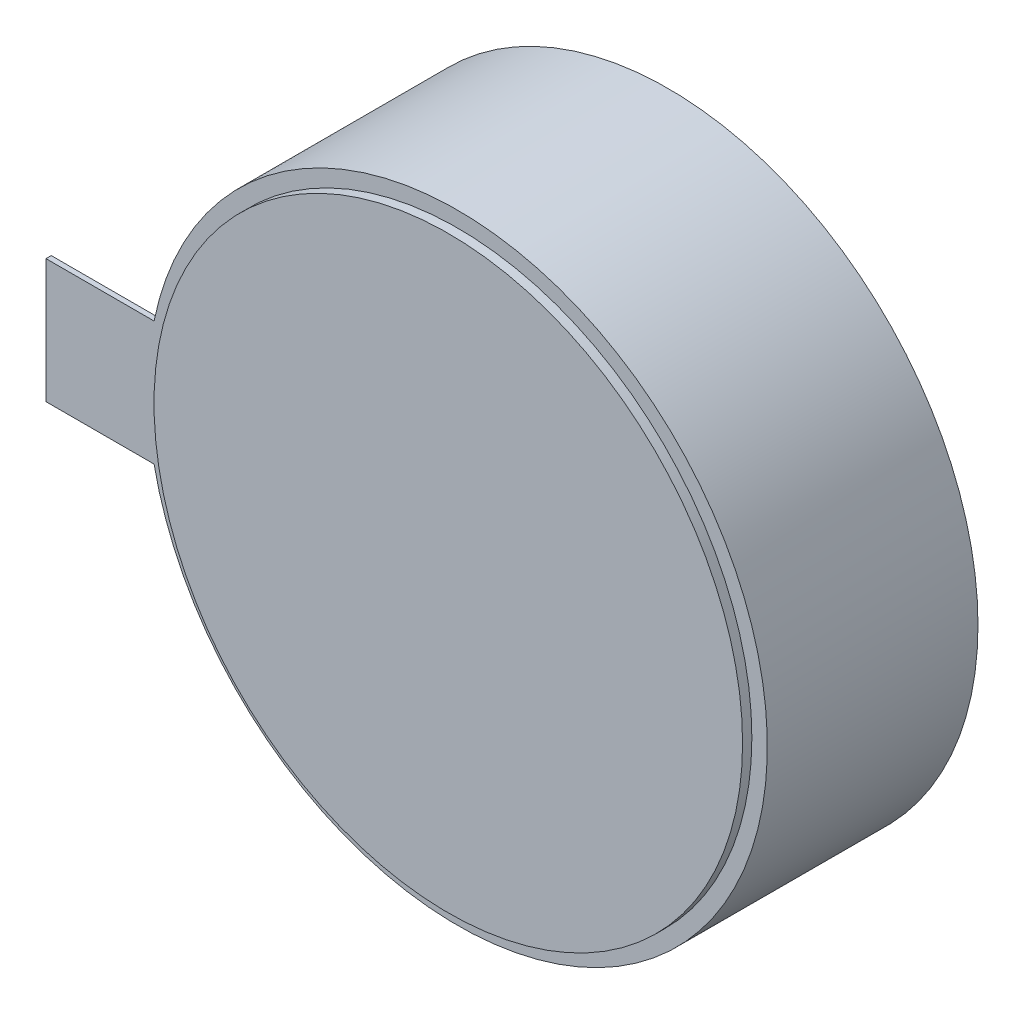
ISO-10303-21;
HEADER;
FILE_DESCRIPTION(('STEP AP214'),'2;1');
FILE_NAME('part.step','',(''),(''),'','','');
FILE_SCHEMA(('AUTOMOTIVE_DESIGN { 1 0 10303 214 1 1 1 1 }'));
ENDSEC;
DATA;
#1=APPLICATION_CONTEXT('core data for automotive mechanical design processes');
#2=APPLICATION_PROTOCOL_DEFINITION('international standard','automotive_design',2000,#1);
#3=PRODUCT_CONTEXT('',#1,'mechanical');
#4=PRODUCT('Part','Part','',(#3));
#5=PRODUCT_RELATED_PRODUCT_CATEGORY('part','',(#4));
#6=PRODUCT_DEFINITION_FORMATION('','',#4);
#7=PRODUCT_DEFINITION_CONTEXT('part definition',#1,'design');
#8=PRODUCT_DEFINITION('design','',#6,#7);
#9=PRODUCT_DEFINITION_SHAPE('','',#8);
#10=(LENGTH_UNIT() NAMED_UNIT(*) SI_UNIT(.MILLI.,.METRE.));
#11=(NAMED_UNIT(*) PLANE_ANGLE_UNIT() SI_UNIT($,.RADIAN.));
#12=(NAMED_UNIT(*) SI_UNIT($,.STERADIAN.) SOLID_ANGLE_UNIT());
#13=UNCERTAINTY_MEASURE_WITH_UNIT(LENGTH_MEASURE(1.E-05),#10,'distance_accuracy_value','');
#14=(GEOMETRIC_REPRESENTATION_CONTEXT(3) GLOBAL_UNCERTAINTY_ASSIGNED_CONTEXT((#13)) GLOBAL_UNIT_ASSIGNED_CONTEXT((#10,
#11,#12)) REPRESENTATION_CONTEXT('',''));
#15=CARTESIAN_POINT('',(0.,0.,0.));
#16=DIRECTION('',(0.,0.,1.));
#17=DIRECTION('',(1.,0.,0.));
#18=AXIS2_PLACEMENT_3D('',#15,#16,#17);
#19=CARTESIAN_POINT('',(0.,0.,3.4));
#20=DIRECTION('',(0.,0.,1.));
#21=DIRECTION('',(1.,0.,0.));
#22=AXIS2_PLACEMENT_3D('',#19,#20,#21);
#23=PLANE('',#22);
#24=CARTESIAN_POINT('',(0.,0.,3.4));
#25=DIRECTION('',(0.,0.,1.));
#26=DIRECTION('',(1.,0.,0.));
#27=AXIS2_PLACEMENT_3D('',#24,#25,#26);
#28=CIRCLE('',#27,4.75);
#29=CARTESIAN_POINT('',(4.75,0.,3.4));
#30=VERTEX_POINT('',#29);
#31=EDGE_CURVE('E100',#30,#30,#28,.T.);
#32=ORIENTED_EDGE('',*,*,#31,.F.);
#33=EDGE_LOOP('',(#32));
#34=FACE_BOUND('',#33,.T.);
#35=DIRECTION('',(1.,0.,0.));
#36=VECTOR('',#35,1.);
#37=CARTESIAN_POINT('',(-4.64354390525168,-1.,3.4));
#38=LINE('',#37,#36);
#39=CARTESIAN_POINT('',(-6.64354390525168,-1.,3.4));
#40=VERTEX_POINT('',#39);
#41=CARTESIAN_POINT('',(-4.89897948556636,-1.,3.4));
#42=VERTEX_POINT('',#41);
#43=EDGE_CURVE('E48',#40,#42,#38,.T.);
#44=ORIENTED_EDGE('',*,*,#43,.T.);
#45=CARTESIAN_POINT('',(0.,0.,3.4));
#46=DIRECTION('',(0.,0.,1.));
#47=DIRECTION('',(1.,0.,0.));
#48=AXIS2_PLACEMENT_3D('',#45,#46,#47);
#49=CIRCLE('',#48,5.);
#50=CARTESIAN_POINT('',(-4.89897948556636,0.999999999999999,3.4));
#51=VERTEX_POINT('',#50);
#52=EDGE_CURVE('E108',#42,#51,#49,.T.);
#53=ORIENTED_EDGE('',*,*,#52,.T.);
#54=DIRECTION('',(-1.,0.,0.));
#55=VECTOR('',#54,1.);
#56=CARTESIAN_POINT('',(-4.64354390525168,0.999999999999999,3.4));
#57=LINE('',#56,#55);
#58=CARTESIAN_POINT('',(-6.64354390525168,0.999999999999999,3.4));
#59=VERTEX_POINT('',#58);
#60=EDGE_CURVE('E96',#51,#59,#57,.T.);
#61=ORIENTED_EDGE('',*,*,#60,.T.);
#62=DIRECTION('',(0.,-1.,0.));
#63=VECTOR('',#62,1.);
#64=CARTESIAN_POINT('',(-6.64354390525168,0.999999999999999,3.4));
#65=LINE('',#64,#63);
#66=EDGE_CURVE('E87',#59,#40,#65,.T.);
#67=ORIENTED_EDGE('',*,*,#66,.T.);
#68=EDGE_LOOP('',(#44,#53,#61,#67));
#69=FACE_BOUND('',#68,.T.);
#70=ADVANCED_FACE('F33',(#34,#69),#23,.T.);
#71=CARTESIAN_POINT('',(0.,0.,3.4));
#72=DIRECTION('',(0.,0.,-1.));
#73=DIRECTION('',(-1.,0.,0.));
#74=AXIS2_PLACEMENT_3D('',#71,#72,#73);
#75=CYLINDRICAL_SURFACE('',#74,5.);
#76=ORIENTED_EDGE('',*,*,#52,.F.);
#77=DIRECTION('',(0.,0.,-1.));
#78=VECTOR('',#77,1.);
#79=CARTESIAN_POINT('',(-4.89897948556636,-1.,3.4));
#80=LINE('',#79,#78);
#81=CARTESIAN_POINT('',(-4.89897948556636,-1.,3.315));
#82=VERTEX_POINT('',#81);
#83=EDGE_CURVE('E11',#42,#82,#80,.T.);
#84=ORIENTED_EDGE('',*,*,#83,.T.);
#85=CARTESIAN_POINT('',(0.,0.,3.315));
#86=DIRECTION('',(0.,0.,1.));
#87=DIRECTION('',(1.,0.,0.));
#88=AXIS2_PLACEMENT_3D('',#85,#86,#87);
#89=CIRCLE('',#88,5.);
#90=CARTESIAN_POINT('',(-4.89897948556636,0.999999999999999,3.315));
#91=VERTEX_POINT('',#90);
#92=EDGE_CURVE('E110',#91,#82,#89,.T.);
#93=ORIENTED_EDGE('',*,*,#92,.F.);
#94=DIRECTION('',(0.,0.,-1.));
#95=VECTOR('',#94,1.);
#96=CARTESIAN_POINT('',(-4.89897948556636,0.999999999999999,3.4));
#97=LINE('',#96,#95);
#98=EDGE_CURVE('E41',#91,#51,#97,.F.);
#99=ORIENTED_EDGE('',*,*,#98,.T.);
#100=EDGE_LOOP('',(#76,#84,#93,#99));
#101=FACE_BOUND('',#100,.T.);
#102=CARTESIAN_POINT('',(0.,0.,0.));
#103=DIRECTION('',(0.,0.,1.));
#104=DIRECTION('',(1.,0.,0.));
#105=AXIS2_PLACEMENT_3D('',#102,#103,#104);
#106=CIRCLE('',#105,5.);
#107=CARTESIAN_POINT('',(5.,0.,0.));
#108=VERTEX_POINT('',#107);
#109=EDGE_CURVE('E105',#108,#108,#106,.T.);
#110=ORIENTED_EDGE('',*,*,#109,.T.);
#111=EDGE_LOOP('',(#110));
#112=FACE_BOUND('',#111,.T.);
#113=ADVANCED_FACE('F35',(#101,#112),#75,.T.);
#114=CARTESIAN_POINT('',(0.,0.,0.));
#115=DIRECTION('',(0.,0.,1.));
#116=DIRECTION('',(1.,0.,0.));
#117=AXIS2_PLACEMENT_3D('',#114,#115,#116);
#118=PLANE('',#117);
#119=ORIENTED_EDGE('',*,*,#109,.F.);
#120=EDGE_LOOP('',(#119));
#121=FACE_BOUND('',#120,.T.);
#122=ADVANCED_FACE('F137',(#121),#118,.F.);
#123=CARTESIAN_POINT('',(0.,0.,3.55));
#124=DIRECTION('',(0.,0.,-1.));
#125=DIRECTION('',(-1.,0.,0.));
#126=AXIS2_PLACEMENT_3D('',#123,#124,#125);
#127=CYLINDRICAL_SURFACE('',#126,4.75);
#128=CARTESIAN_POINT('',(0.,0.,3.55));
#129=DIRECTION('',(0.,0.,1.));
#130=DIRECTION('',(1.,0.,0.));
#131=AXIS2_PLACEMENT_3D('',#128,#129,#130);
#132=CIRCLE('',#131,4.75);
#133=CARTESIAN_POINT('',(4.75,0.,3.55));
#134=VERTEX_POINT('',#133);
#135=EDGE_CURVE('E102',#134,#134,#132,.T.);
#136=ORIENTED_EDGE('',*,*,#135,.F.);
#137=EDGE_LOOP('',(#136));
#138=FACE_BOUND('',#137,.T.);
#139=ORIENTED_EDGE('',*,*,#31,.T.);
#140=EDGE_LOOP('',(#139));
#141=FACE_BOUND('',#140,.T.);
#142=ADVANCED_FACE('F126',(#138,#141),#127,.T.);
#143=CARTESIAN_POINT('',(0.,0.,3.55));
#144=DIRECTION('',(0.,0.,1.));
#145=DIRECTION('',(1.,0.,0.));
#146=AXIS2_PLACEMENT_3D('',#143,#144,#145);
#147=PLANE('',#146);
#148=ORIENTED_EDGE('',*,*,#135,.T.);
#149=EDGE_LOOP('',(#148));
#150=FACE_BOUND('',#149,.T.);
#151=ADVANCED_FACE('F119',(#150),#147,.T.);
#152=CARTESIAN_POINT('',(-4.64354390525168,-1.,3.315));
#153=DIRECTION('',(0.,-1.,0.));
#154=DIRECTION('',(1.,0.,0.));
#155=AXIS2_PLACEMENT_3D('',#152,#153,#154);
#156=PLANE('',#155);
#157=ORIENTED_EDGE('',*,*,#83,.F.);
#158=ORIENTED_EDGE('',*,*,#43,.F.);
#159=DIRECTION('',(0.,0.,1.));
#160=VECTOR('',#159,1.);
#161=CARTESIAN_POINT('',(-6.64354390525168,-1.,3.315));
#162=LINE('',#161,#160);
#163=CARTESIAN_POINT('',(-6.64354390525168,-1.,3.315));
#164=VERTEX_POINT('',#163);
#165=EDGE_CURVE('E88',#164,#40,#162,.T.);
#166=ORIENTED_EDGE('',*,*,#165,.F.);
#167=DIRECTION('',(1.,0.,0.));
#168=VECTOR('',#167,1.);
#169=CARTESIAN_POINT('',(-4.64354390525168,-1.,3.315));
#170=LINE('',#169,#168);
#171=EDGE_CURVE('E89',#164,#82,#170,.T.);
#172=ORIENTED_EDGE('',*,*,#171,.T.);
#173=EDGE_LOOP('',(#157,#158,#166,#172));
#174=FACE_BOUND('',#173,.T.);
#175=ADVANCED_FACE('F117',(#174),#156,.T.);
#176=CARTESIAN_POINT('',(-4.64354390525168,0.999999999999999,3.315));
#177=DIRECTION('',(0.,1.,0.));
#178=DIRECTION('',(-1.,0.,0.));
#179=AXIS2_PLACEMENT_3D('',#176,#177,#178);
#180=PLANE('',#179);
#181=ORIENTED_EDGE('',*,*,#98,.F.);
#182=DIRECTION('',(-1.,0.,0.));
#183=VECTOR('',#182,1.);
#184=CARTESIAN_POINT('',(-4.64354390525168,0.999999999999999,3.315));
#185=LINE('',#184,#183);
#186=CARTESIAN_POINT('',(-6.64354390525168,0.999999999999999,3.315));
#187=VERTEX_POINT('',#186);
#188=EDGE_CURVE('E73',#91,#187,#185,.T.);
#189=ORIENTED_EDGE('',*,*,#188,.T.);
#190=DIRECTION('',(0.,0.,1.));
#191=VECTOR('',#190,1.);
#192=CARTESIAN_POINT('',(-6.64354390525168,0.999999999999999,3.315));
#193=LINE('',#192,#191);
#194=EDGE_CURVE('E76',#187,#59,#193,.T.);
#195=ORIENTED_EDGE('',*,*,#194,.T.);
#196=ORIENTED_EDGE('',*,*,#60,.F.);
#197=EDGE_LOOP('',(#181,#189,#195,#196));
#198=FACE_BOUND('',#197,.T.);
#199=ADVANCED_FACE('F75',(#198),#180,.T.);
#200=CARTESIAN_POINT('',(0.,0.,3.315));
#201=DIRECTION('',(0.,0.,1.));
#202=DIRECTION('',(1.,0.,0.));
#203=AXIS2_PLACEMENT_3D('',#200,#201,#202);
#204=PLANE('',#203);
#205=ORIENTED_EDGE('',*,*,#188,.F.);
#206=ORIENTED_EDGE('',*,*,#92,.T.);
#207=ORIENTED_EDGE('',*,*,#171,.F.);
#208=DIRECTION('',(0.,-1.,0.));
#209=VECTOR('',#208,1.);
#210=CARTESIAN_POINT('',(-6.64354390525168,0.999999999999999,3.315));
#211=LINE('',#210,#209);
#212=EDGE_CURVE('E81',#187,#164,#211,.T.);
#213=ORIENTED_EDGE('',*,*,#212,.F.);
#214=EDGE_LOOP('',(#205,#206,#207,#213));
#215=FACE_BOUND('',#214,.T.);
#216=ADVANCED_FACE('F91',(#215),#204,.F.);
#217=CARTESIAN_POINT('',(-6.64354390525168,0.999999999999999,3.315));
#218=DIRECTION('',(-1.,0.,0.));
#219=DIRECTION('',(0.,0.,1.));
#220=AXIS2_PLACEMENT_3D('',#217,#218,#219);
#221=PLANE('',#220);
#222=ORIENTED_EDGE('',*,*,#66,.F.);
#223=ORIENTED_EDGE('',*,*,#194,.F.);
#224=ORIENTED_EDGE('',*,*,#212,.T.);
#225=ORIENTED_EDGE('',*,*,#165,.T.);
#226=EDGE_LOOP('',(#222,#223,#224,#225));
#227=FACE_BOUND('',#226,.T.);
#228=ADVANCED_FACE('F85',(#227),#221,.T.);
#229=CLOSED_SHELL('',(#70,#113,#122,#142,#151,#175,#199,#216,#228));
#230=MANIFOLD_SOLID_BREP('B2',#229);
#231=ADVANCED_BREP_SHAPE_REPRESENTATION('',(#18,#230),#14);
#232=SHAPE_DEFINITION_REPRESENTATION(#9,#231);
ENDSEC;
END-ISO-10303-21;
